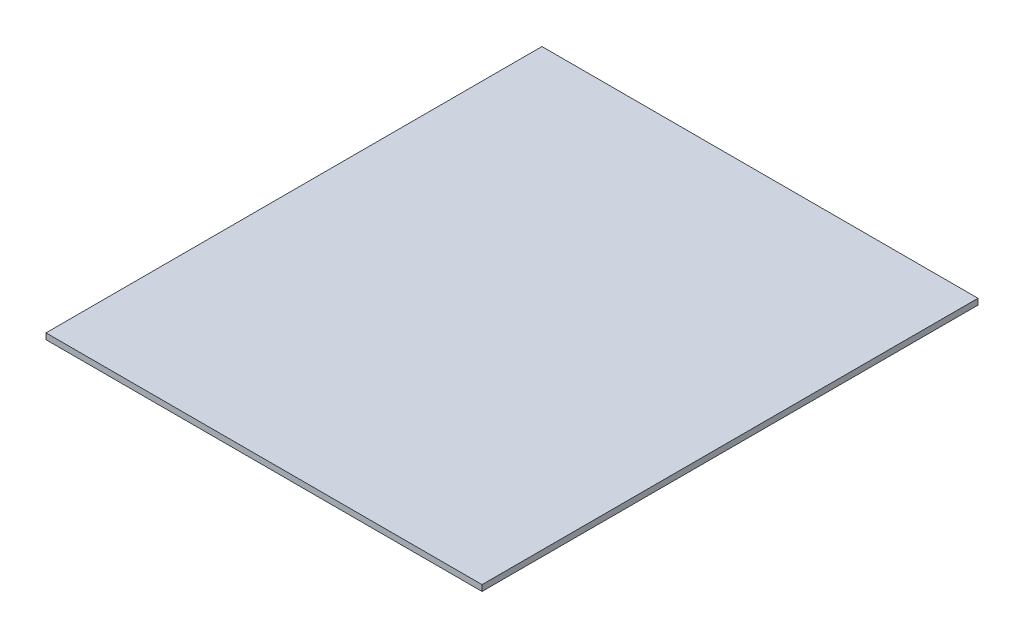
ISO-10303-21;
HEADER;
FILE_DESCRIPTION(('STEP AP214'),'2;1');
FILE_NAME('part.step','',(''),(''),'','','');
FILE_SCHEMA(('AUTOMOTIVE_DESIGN { 1 0 10303 214 1 1 1 1 }'));
ENDSEC;
DATA;
#1=APPLICATION_CONTEXT('core data for automotive mechanical design processes');
#2=APPLICATION_PROTOCOL_DEFINITION('international standard','automotive_design',2000,#1);
#3=PRODUCT_CONTEXT('',#1,'mechanical');
#4=PRODUCT('Part','Part','',(#3));
#5=PRODUCT_RELATED_PRODUCT_CATEGORY('part','',(#4));
#6=PRODUCT_DEFINITION_FORMATION('','',#4);
#7=PRODUCT_DEFINITION_CONTEXT('part definition',#1,'design');
#8=PRODUCT_DEFINITION('design','',#6,#7);
#9=PRODUCT_DEFINITION_SHAPE('','',#8);
#10=(LENGTH_UNIT() NAMED_UNIT(*) SI_UNIT(.MILLI.,.METRE.));
#11=(NAMED_UNIT(*) PLANE_ANGLE_UNIT() SI_UNIT($,.RADIAN.));
#12=(NAMED_UNIT(*) SI_UNIT($,.STERADIAN.) SOLID_ANGLE_UNIT());
#13=UNCERTAINTY_MEASURE_WITH_UNIT(LENGTH_MEASURE(1.E-05),#10,'distance_accuracy_value','');
#14=(GEOMETRIC_REPRESENTATION_CONTEXT(3) GLOBAL_UNCERTAINTY_ASSIGNED_CONTEXT((#13)) GLOBAL_UNIT_ASSIGNED_CONTEXT((#10,
#11,#12)) REPRESENTATION_CONTEXT('',''));
#15=CARTESIAN_POINT('',(0.,0.,0.));
#16=DIRECTION('',(0.,0.,1.));
#17=DIRECTION('',(1.,0.,0.));
#18=AXIS2_PLACEMENT_3D('',#15,#16,#17);
#19=CARTESIAN_POINT('',(0.,3.,0.));
#20=DIRECTION('',(1.,0.,0.));
#21=DIRECTION('',(0.,0.,-1.));
#22=AXIS2_PLACEMENT_3D('',#19,#20,#21);
#23=PLANE('',#22);
#24=DIRECTION('',(0.,0.,1.));
#25=VECTOR('',#24,1.);
#26=CARTESIAN_POINT('',(0.,0.,0.));
#27=LINE('',#26,#25);
#28=CARTESIAN_POINT('',(0.,0.,-250.));
#29=VERTEX_POINT('',#28);
#30=CARTESIAN_POINT('',(0.,0.,0.));
#31=VERTEX_POINT('',#30);
#32=EDGE_CURVE('E97',#29,#31,#27,.T.);
#33=ORIENTED_EDGE('',*,*,#32,.T.);
#34=DIRECTION('',(0.,-1.,0.));
#35=VECTOR('',#34,1.);
#36=CARTESIAN_POINT('',(0.,3.,0.));
#37=LINE('',#36,#35);
#38=CARTESIAN_POINT('',(0.,3.,0.));
#39=VERTEX_POINT('',#38);
#40=EDGE_CURVE('E11',#39,#31,#37,.T.);
#41=ORIENTED_EDGE('',*,*,#40,.F.);
#42=DIRECTION('',(0.,0.,1.));
#43=VECTOR('',#42,1.);
#44=CARTESIAN_POINT('',(0.,3.,0.));
#45=LINE('',#44,#43);
#46=CARTESIAN_POINT('',(0.,3.,-250.));
#47=VERTEX_POINT('',#46);
#48=EDGE_CURVE('E85',#47,#39,#45,.T.);
#49=ORIENTED_EDGE('',*,*,#48,.F.);
#50=DIRECTION('',(0.,-1.,0.));
#51=VECTOR('',#50,1.);
#52=CARTESIAN_POINT('',(0.,3.,-250.));
#53=LINE('',#52,#51);
#54=EDGE_CURVE('E93',#47,#29,#53,.T.);
#55=ORIENTED_EDGE('',*,*,#54,.T.);
#56=EDGE_LOOP('',(#33,#41,#49,#55));
#57=FACE_BOUND('',#56,.T.);
#58=ADVANCED_FACE('F34',(#57),#23,.F.);
#59=CARTESIAN_POINT('',(0.,3.,0.));
#60=DIRECTION('',(0.,0.,-1.));
#61=DIRECTION('',(-1.,0.,0.));
#62=AXIS2_PLACEMENT_3D('',#59,#60,#61);
#63=PLANE('',#62);
#64=DIRECTION('',(1.,0.,0.));
#65=VECTOR('',#64,1.);
#66=CARTESIAN_POINT('',(0.,0.,0.));
#67=LINE('',#66,#65);
#68=CARTESIAN_POINT('',(219.79,0.,0.));
#69=VERTEX_POINT('',#68);
#70=EDGE_CURVE('E89',#31,#69,#67,.T.);
#71=ORIENTED_EDGE('',*,*,#70,.T.);
#72=DIRECTION('',(0.,-1.,0.));
#73=VECTOR('',#72,1.);
#74=CARTESIAN_POINT('',(219.79,3.,0.));
#75=LINE('',#74,#73);
#76=CARTESIAN_POINT('',(219.79,3.,0.));
#77=VERTEX_POINT('',#76);
#78=EDGE_CURVE('E42',#77,#69,#75,.T.);
#79=ORIENTED_EDGE('',*,*,#78,.F.);
#80=DIRECTION('',(1.,0.,0.));
#81=VECTOR('',#80,1.);
#82=CARTESIAN_POINT('',(0.,3.,0.));
#83=LINE('',#82,#81);
#84=EDGE_CURVE('E80',#39,#77,#83,.T.);
#85=ORIENTED_EDGE('',*,*,#84,.F.);
#86=ORIENTED_EDGE('',*,*,#40,.T.);
#87=EDGE_LOOP('',(#71,#79,#85,#86));
#88=FACE_BOUND('',#87,.T.);
#89=ADVANCED_FACE('F88',(#88),#63,.F.);
#90=CARTESIAN_POINT('',(219.79,3.,0.));
#91=DIRECTION('',(-1.,0.,0.));
#92=DIRECTION('',(0.,0.,1.));
#93=AXIS2_PLACEMENT_3D('',#90,#91,#92);
#94=PLANE('',#93);
#95=DIRECTION('',(0.,0.,-1.));
#96=VECTOR('',#95,1.);
#97=CARTESIAN_POINT('',(219.79,0.,0.));
#98=LINE('',#97,#96);
#99=CARTESIAN_POINT('',(219.79,0.,-250.));
#100=VERTEX_POINT('',#99);
#101=EDGE_CURVE('E67',#69,#100,#98,.T.);
#102=ORIENTED_EDGE('',*,*,#101,.T.);
#103=DIRECTION('',(0.,-1.,0.));
#104=VECTOR('',#103,1.);
#105=CARTESIAN_POINT('',(219.79,3.,-250.));
#106=LINE('',#105,#104);
#107=CARTESIAN_POINT('',(219.79,3.,-250.));
#108=VERTEX_POINT('',#107);
#109=EDGE_CURVE('E90',#108,#100,#106,.T.);
#110=ORIENTED_EDGE('',*,*,#109,.F.);
#111=DIRECTION('',(0.,0.,-1.));
#112=VECTOR('',#111,1.);
#113=CARTESIAN_POINT('',(219.79,3.,0.));
#114=LINE('',#113,#112);
#115=EDGE_CURVE('E83',#77,#108,#114,.T.);
#116=ORIENTED_EDGE('',*,*,#115,.F.);
#117=ORIENTED_EDGE('',*,*,#78,.T.);
#118=EDGE_LOOP('',(#102,#110,#116,#117));
#119=FACE_BOUND('',#118,.T.);
#120=ADVANCED_FACE('F91',(#119),#94,.F.);
#121=CARTESIAN_POINT('',(0.,3.,-250.));
#122=DIRECTION('',(0.,0.,1.));
#123=DIRECTION('',(1.,0.,0.));
#124=AXIS2_PLACEMENT_3D('',#121,#122,#123);
#125=PLANE('',#124);
#126=DIRECTION('',(-1.,0.,0.));
#127=VECTOR('',#126,1.);
#128=CARTESIAN_POINT('',(0.,0.,-250.));
#129=LINE('',#128,#127);
#130=EDGE_CURVE('E73',#100,#29,#129,.T.);
#131=ORIENTED_EDGE('',*,*,#130,.T.);
#132=ORIENTED_EDGE('',*,*,#54,.F.);
#133=DIRECTION('',(-1.,0.,0.));
#134=VECTOR('',#133,1.);
#135=CARTESIAN_POINT('',(0.,3.,-250.));
#136=LINE('',#135,#134);
#137=EDGE_CURVE('E50',#108,#47,#136,.T.);
#138=ORIENTED_EDGE('',*,*,#137,.F.);
#139=ORIENTED_EDGE('',*,*,#109,.T.);
#140=EDGE_LOOP('',(#131,#132,#138,#139));
#141=FACE_BOUND('',#140,.T.);
#142=ADVANCED_FACE('F104',(#141),#125,.F.);
#143=CARTESIAN_POINT('',(0.,3.,0.));
#144=DIRECTION('',(0.,-1.,0.));
#145=DIRECTION('',(0.,0.,-1.));
#146=AXIS2_PLACEMENT_3D('',#143,#144,#145);
#147=PLANE('',#146);
#148=ORIENTED_EDGE('',*,*,#48,.T.);
#149=ORIENTED_EDGE('',*,*,#84,.T.);
#150=ORIENTED_EDGE('',*,*,#115,.T.);
#151=ORIENTED_EDGE('',*,*,#137,.T.);
#152=EDGE_LOOP('',(#148,#149,#150,#151));
#153=FACE_BOUND('',#152,.T.);
#154=ADVANCED_FACE('F81',(#153),#147,.F.);
#155=CARTESIAN_POINT('',(0.,0.,0.));
#156=DIRECTION('',(0.,-1.,0.));
#157=DIRECTION('',(0.,0.,-1.));
#158=AXIS2_PLACEMENT_3D('',#155,#156,#157);
#159=PLANE('',#158);
#160=ORIENTED_EDGE('',*,*,#32,.F.);
#161=ORIENTED_EDGE('',*,*,#130,.F.);
#162=ORIENTED_EDGE('',*,*,#101,.F.);
#163=ORIENTED_EDGE('',*,*,#70,.F.);
#164=EDGE_LOOP('',(#160,#161,#162,#163));
#165=FACE_BOUND('',#164,.T.);
#166=ADVANCED_FACE('F107',(#165),#159,.T.);
#167=CLOSED_SHELL('',(#58,#89,#120,#142,#154,#166));
#168=MANIFOLD_SOLID_BREP('B2',#167);
#169=ADVANCED_BREP_SHAPE_REPRESENTATION('',(#18,#168),#14);
#170=SHAPE_DEFINITION_REPRESENTATION(#9,#169);
ENDSEC;
END-ISO-10303-21;
